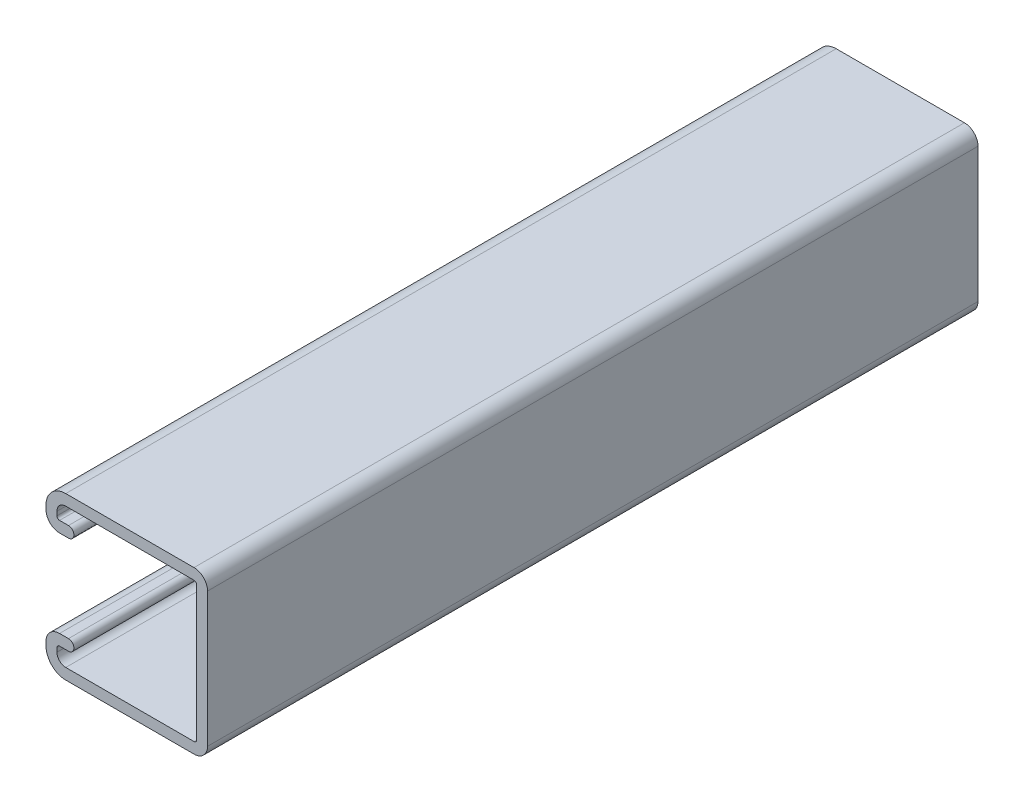
ISO-10303-21;
HEADER;
FILE_DESCRIPTION(('STEP AP214'),'2;1');
FILE_NAME('part.step','',(''),(''),'','','');
FILE_SCHEMA(('AUTOMOTIVE_DESIGN { 1 0 10303 214 1 1 1 1 }'));
ENDSEC;
DATA;
#1=APPLICATION_CONTEXT('core data for automotive mechanical design processes');
#2=APPLICATION_PROTOCOL_DEFINITION('international standard','automotive_design',2000,#1);
#3=PRODUCT_CONTEXT('',#1,'mechanical');
#4=PRODUCT('Part','Part','',(#3));
#5=PRODUCT_RELATED_PRODUCT_CATEGORY('part','',(#4));
#6=PRODUCT_DEFINITION_FORMATION('','',#4);
#7=PRODUCT_DEFINITION_CONTEXT('part definition',#1,'design');
#8=PRODUCT_DEFINITION('design','',#6,#7);
#9=PRODUCT_DEFINITION_SHAPE('','',#8);
#10=(LENGTH_UNIT() NAMED_UNIT(*) SI_UNIT(.MILLI.,.METRE.));
#11=(NAMED_UNIT(*) PLANE_ANGLE_UNIT() SI_UNIT($,.RADIAN.));
#12=(NAMED_UNIT(*) SI_UNIT($,.STERADIAN.) SOLID_ANGLE_UNIT());
#13=UNCERTAINTY_MEASURE_WITH_UNIT(LENGTH_MEASURE(1.E-05),#10,'distance_accuracy_value','');
#14=(GEOMETRIC_REPRESENTATION_CONTEXT(3) GLOBAL_UNCERTAINTY_ASSIGNED_CONTEXT((#13)) GLOBAL_UNIT_ASSIGNED_CONTEXT((#10,
#11,#12)) REPRESENTATION_CONTEXT('',''));
#15=CARTESIAN_POINT('',(0.,0.,0.));
#16=DIRECTION('',(0.,0.,1.));
#17=DIRECTION('',(1.,0.,0.));
#18=AXIS2_PLACEMENT_3D('',#15,#16,#17);
#19=CARTESIAN_POINT('',(-36.22675,15.58925,-98.425));
#20=DIRECTION('',(0.,0.,1.));
#21=DIRECTION('',(1.,0.,0.));
#22=AXIS2_PLACEMENT_3D('',#19,#20,#21);
#23=CYLINDRICAL_SURFACE('',#22,5.04825);
#24=CARTESIAN_POINT('',(-36.22675,15.58925,98.425));
#25=DIRECTION('',(0.,0.,1.));
#26=DIRECTION('',(1.,0.,0.));
#27=AXIS2_PLACEMENT_3D('',#24,#25,#26);
#28=CIRCLE('',#27,5.04825);
#29=CARTESIAN_POINT('',(-36.22675,20.6375,98.425));
#30=VERTEX_POINT('',#29);
#31=CARTESIAN_POINT('',(-41.275,15.58925,98.425));
#32=VERTEX_POINT('',#31);
#33=EDGE_CURVE('E252',#30,#32,#28,.T.);
#34=ORIENTED_EDGE('',*,*,#33,.F.);
#35=DIRECTION('',(0.,0.,1.));
#36=VECTOR('',#35,1.);
#37=CARTESIAN_POINT('',(-36.22675,20.6375,-98.425));
#38=LINE('',#37,#36);
#39=CARTESIAN_POINT('',(-36.22675,20.6375,-98.425));
#40=VERTEX_POINT('',#39);
#41=EDGE_CURVE('E11',#40,#30,#38,.T.);
#42=ORIENTED_EDGE('',*,*,#41,.F.);
#43=CARTESIAN_POINT('',(-36.22675,15.58925,-98.425));
#44=DIRECTION('',(0.,0.,1.));
#45=DIRECTION('',(1.,0.,0.));
#46=AXIS2_PLACEMENT_3D('',#43,#44,#45);
#47=CIRCLE('',#46,5.04825);
#48=CARTESIAN_POINT('',(-41.275,15.58925,-98.425));
#49=VERTEX_POINT('',#48);
#50=EDGE_CURVE('E332',#40,#49,#47,.T.);
#51=ORIENTED_EDGE('',*,*,#50,.T.);
#52=DIRECTION('',(0.,0.,1.));
#53=VECTOR('',#52,1.);
#54=CARTESIAN_POINT('',(-41.275,15.58925,-98.425));
#55=LINE('',#54,#53);
#56=EDGE_CURVE('E38',#49,#32,#55,.T.);
#57=ORIENTED_EDGE('',*,*,#56,.T.);
#58=EDGE_LOOP('',(#34,#42,#51,#57));
#59=FACE_BOUND('',#58,.T.);
#60=ADVANCED_FACE('F35',(#59),#23,.T.);
#61=CARTESIAN_POINT('',(-36.22675,20.6375,-98.425));
#62=DIRECTION('',(0.,1.,0.));
#63=DIRECTION('',(-1.,0.,0.));
#64=AXIS2_PLACEMENT_3D('',#61,#62,#63);
#65=PLANE('',#64);
#66=DIRECTION('',(-1.,0.,0.));
#67=VECTOR('',#66,1.);
#68=CARTESIAN_POINT('',(-36.22675,20.6375,98.425));
#69=LINE('',#68,#67);
#70=CARTESIAN_POINT('',(-3.46075,20.6375,98.425));
#71=VERTEX_POINT('',#70);
#72=EDGE_CURVE('E330',#71,#30,#69,.T.);
#73=ORIENTED_EDGE('',*,*,#72,.F.);
#74=DIRECTION('',(0.,0.,1.));
#75=VECTOR('',#74,1.);
#76=CARTESIAN_POINT('',(-3.46075,20.6375,-98.425));
#77=LINE('',#76,#75);
#78=CARTESIAN_POINT('',(-3.46075,20.6375,-98.425));
#79=VERTEX_POINT('',#78);
#80=EDGE_CURVE('E44',#79,#71,#77,.T.);
#81=ORIENTED_EDGE('',*,*,#80,.F.);
#82=DIRECTION('',(-1.,0.,0.));
#83=VECTOR('',#82,1.);
#84=CARTESIAN_POINT('',(-36.22675,20.6375,-98.425));
#85=LINE('',#84,#83);
#86=EDGE_CURVE('E242',#79,#40,#85,.T.);
#87=ORIENTED_EDGE('',*,*,#86,.T.);
#88=ORIENTED_EDGE('',*,*,#41,.T.);
#89=EDGE_LOOP('',(#73,#81,#87,#88));
#90=FACE_BOUND('',#89,.T.);
#91=ADVANCED_FACE('F384',(#90),#65,.T.);
#92=CARTESIAN_POINT('',(-3.46075,17.17675,-98.425));
#93=DIRECTION('',(0.,0.,1.));
#94=DIRECTION('',(1.,0.,0.));
#95=AXIS2_PLACEMENT_3D('',#92,#93,#94);
#96=CYLINDRICAL_SURFACE('',#95,3.46075);
#97=CARTESIAN_POINT('',(-3.46075,17.17675,98.425));
#98=DIRECTION('',(0.,0.,1.));
#99=DIRECTION('',(1.,0.,0.));
#100=AXIS2_PLACEMENT_3D('',#97,#98,#99);
#101=CIRCLE('',#100,3.46075);
#102=CARTESIAN_POINT('',(0.,17.17675,98.425));
#103=VERTEX_POINT('',#102);
#104=EDGE_CURVE('E229',#103,#71,#101,.T.);
#105=ORIENTED_EDGE('',*,*,#104,.F.);
#106=DIRECTION('',(0.,0.,1.));
#107=VECTOR('',#106,1.);
#108=CARTESIAN_POINT('',(0.,17.17675,-98.425));
#109=LINE('',#108,#107);
#110=CARTESIAN_POINT('',(0.,17.17675,-98.425));
#111=VERTEX_POINT('',#110);
#112=EDGE_CURVE('E224',#111,#103,#109,.T.);
#113=ORIENTED_EDGE('',*,*,#112,.F.);
#114=CARTESIAN_POINT('',(-3.46075,17.17675,-98.425));
#115=DIRECTION('',(0.,0.,1.));
#116=DIRECTION('',(1.,0.,0.));
#117=AXIS2_PLACEMENT_3D('',#114,#115,#116);
#118=CIRCLE('',#117,3.46075);
#119=EDGE_CURVE('E227',#111,#79,#118,.T.);
#120=ORIENTED_EDGE('',*,*,#119,.T.);
#121=ORIENTED_EDGE('',*,*,#80,.T.);
#122=EDGE_LOOP('',(#105,#113,#120,#121));
#123=FACE_BOUND('',#122,.T.);
#124=ADVANCED_FACE('F226',(#123),#96,.T.);
#125=CARTESIAN_POINT('',(0.,17.17675,-98.425));
#126=DIRECTION('',(1.,0.,0.));
#127=DIRECTION('',(0.,1.,0.));
#128=AXIS2_PLACEMENT_3D('',#125,#126,#127);
#129=PLANE('',#128);
#130=DIRECTION('',(0.,1.,0.));
#131=VECTOR('',#130,1.);
#132=CARTESIAN_POINT('',(0.,17.17675,98.425));
#133=LINE('',#132,#131);
#134=CARTESIAN_POINT('',(0.,-17.17675,98.425));
#135=VERTEX_POINT('',#134);
#136=EDGE_CURVE('E327',#135,#103,#133,.T.);
#137=ORIENTED_EDGE('',*,*,#136,.F.);
#138=DIRECTION('',(0.,0.,1.));
#139=VECTOR('',#138,1.);
#140=CARTESIAN_POINT('',(0.,-17.17675,-98.425));
#141=LINE('',#140,#139);
#142=CARTESIAN_POINT('',(0.,-17.17675,-98.425));
#143=VERTEX_POINT('',#142);
#144=EDGE_CURVE('E234',#143,#135,#141,.T.);
#145=ORIENTED_EDGE('',*,*,#144,.F.);
#146=DIRECTION('',(0.,1.,0.));
#147=VECTOR('',#146,1.);
#148=CARTESIAN_POINT('',(0.,17.17675,-98.425));
#149=LINE('',#148,#147);
#150=EDGE_CURVE('E240',#143,#111,#149,.T.);
#151=ORIENTED_EDGE('',*,*,#150,.T.);
#152=ORIENTED_EDGE('',*,*,#112,.T.);
#153=EDGE_LOOP('',(#137,#145,#151,#152));
#154=FACE_BOUND('',#153,.T.);
#155=ADVANCED_FACE('F244',(#154),#129,.T.);
#156=CARTESIAN_POINT('',(-3.46075,-17.17675,-98.425));
#157=DIRECTION('',(0.,0.,1.));
#158=DIRECTION('',(1.,0.,0.));
#159=AXIS2_PLACEMENT_3D('',#156,#157,#158);
#160=CYLINDRICAL_SURFACE('',#159,3.46075);
#161=CARTESIAN_POINT('',(-3.46075,-17.17675,98.425));
#162=DIRECTION('',(0.,0.,1.));
#163=DIRECTION('',(-1.,0.,0.));
#164=AXIS2_PLACEMENT_3D('',#161,#162,#163);
#165=CIRCLE('',#164,3.46075);
#166=CARTESIAN_POINT('',(-3.46075,-20.6375,98.425));
#167=VERTEX_POINT('',#166);
#168=EDGE_CURVE('E324',#167,#135,#165,.T.);
#169=ORIENTED_EDGE('',*,*,#168,.F.);
#170=DIRECTION('',(0.,0.,1.));
#171=VECTOR('',#170,1.);
#172=CARTESIAN_POINT('',(-3.46075,-20.6375,-98.425));
#173=LINE('',#172,#171);
#174=CARTESIAN_POINT('',(-3.46075,-20.6375,-98.425));
#175=VERTEX_POINT('',#174);
#176=EDGE_CURVE('E336',#175,#167,#173,.T.);
#177=ORIENTED_EDGE('',*,*,#176,.F.);
#178=CARTESIAN_POINT('',(-3.46075,-17.17675,-98.425));
#179=DIRECTION('',(0.,0.,1.));
#180=DIRECTION('',(-1.,0.,0.));
#181=AXIS2_PLACEMENT_3D('',#178,#179,#180);
#182=CIRCLE('',#181,3.46075);
#183=EDGE_CURVE('E245',#175,#143,#182,.T.);
#184=ORIENTED_EDGE('',*,*,#183,.T.);
#185=ORIENTED_EDGE('',*,*,#144,.T.);
#186=EDGE_LOOP('',(#169,#177,#184,#185));
#187=FACE_BOUND('',#186,.T.);
#188=ADVANCED_FACE('F397',(#187),#160,.T.);
#189=CARTESIAN_POINT('',(-36.22675,-20.6375,-98.425));
#190=DIRECTION('',(0.,-1.,0.));
#191=DIRECTION('',(1.,0.,0.));
#192=AXIS2_PLACEMENT_3D('',#189,#190,#191);
#193=PLANE('',#192);
#194=DIRECTION('',(1.,0.,0.));
#195=VECTOR('',#194,1.);
#196=CARTESIAN_POINT('',(-36.22675,-20.6375,98.425));
#197=LINE('',#196,#195);
#198=CARTESIAN_POINT('',(-36.22675,-20.6375,98.425));
#199=VERTEX_POINT('',#198);
#200=EDGE_CURVE('E321',#199,#167,#197,.T.);
#201=ORIENTED_EDGE('',*,*,#200,.F.);
#202=DIRECTION('',(0.,0.,1.));
#203=VECTOR('',#202,1.);
#204=CARTESIAN_POINT('',(-36.22675,-20.6375,-98.425));
#205=LINE('',#204,#203);
#206=CARTESIAN_POINT('',(-36.22675,-20.6375,-98.425));
#207=VERTEX_POINT('',#206);
#208=EDGE_CURVE('E338',#207,#199,#205,.T.);
#209=ORIENTED_EDGE('',*,*,#208,.F.);
#210=DIRECTION('',(1.,0.,0.));
#211=VECTOR('',#210,1.);
#212=CARTESIAN_POINT('',(-36.22675,-20.6375,-98.425));
#213=LINE('',#212,#211);
#214=EDGE_CURVE('E247',#207,#175,#213,.T.);
#215=ORIENTED_EDGE('',*,*,#214,.T.);
#216=ORIENTED_EDGE('',*,*,#176,.T.);
#217=EDGE_LOOP('',(#201,#209,#215,#216));
#218=FACE_BOUND('',#217,.T.);
#219=ADVANCED_FACE('F400',(#218),#193,.T.);
#220=CARTESIAN_POINT('',(-36.22675,-15.58925,-98.425));
#221=DIRECTION('',(0.,0.,1.));
#222=DIRECTION('',(1.,0.,0.));
#223=AXIS2_PLACEMENT_3D('',#220,#221,#222);
#224=CYLINDRICAL_SURFACE('',#223,5.04825);
#225=CARTESIAN_POINT('',(-36.22675,-15.58925,98.425));
#226=DIRECTION('',(0.,0.,1.));
#227=DIRECTION('',(-1.,0.,0.));
#228=AXIS2_PLACEMENT_3D('',#225,#226,#227);
#229=CIRCLE('',#228,5.04825);
#230=CARTESIAN_POINT('',(-41.275,-15.58925,98.425));
#231=VERTEX_POINT('',#230);
#232=EDGE_CURVE('E318',#231,#199,#229,.T.);
#233=ORIENTED_EDGE('',*,*,#232,.F.);
#234=DIRECTION('',(0.,0.,1.));
#235=VECTOR('',#234,1.);
#236=CARTESIAN_POINT('',(-41.275,-15.58925,-98.425));
#237=LINE('',#236,#235);
#238=CARTESIAN_POINT('',(-41.275,-15.58925,-98.425));
#239=VERTEX_POINT('',#238);
#240=EDGE_CURVE('E340',#239,#231,#237,.T.);
#241=ORIENTED_EDGE('',*,*,#240,.F.);
#242=CARTESIAN_POINT('',(-36.22675,-15.58925,-98.425));
#243=DIRECTION('',(0.,0.,1.));
#244=DIRECTION('',(-1.,0.,0.));
#245=AXIS2_PLACEMENT_3D('',#242,#243,#244);
#246=CIRCLE('',#245,5.04825);
#247=EDGE_CURVE('E745',#239,#207,#246,.T.);
#248=ORIENTED_EDGE('',*,*,#247,.T.);
#249=ORIENTED_EDGE('',*,*,#208,.T.);
#250=EDGE_LOOP('',(#233,#241,#248,#249));
#251=FACE_BOUND('',#250,.T.);
#252=ADVANCED_FACE('F404',(#251),#224,.T.);
#253=CARTESIAN_POINT('',(-41.275,-15.58925,-98.425));
#254=DIRECTION('',(-1.,0.,0.));
#255=DIRECTION('',(0.,0.,1.));
#256=AXIS2_PLACEMENT_3D('',#253,#254,#255);
#257=PLANE('',#256);
#258=DIRECTION('',(0.,-1.,0.));
#259=VECTOR('',#258,1.);
#260=CARTESIAN_POINT('',(-41.275,-15.58925,98.425));
#261=LINE('',#260,#259);
#262=CARTESIAN_POINT('',(-41.275,-14.57325,98.425));
#263=VERTEX_POINT('',#262);
#264=EDGE_CURVE('E315',#263,#231,#261,.T.);
#265=ORIENTED_EDGE('',*,*,#264,.F.);
#266=DIRECTION('',(0.,0.,1.));
#267=VECTOR('',#266,1.);
#268=CARTESIAN_POINT('',(-41.275,-14.57325,-98.425));
#269=LINE('',#268,#267);
#270=CARTESIAN_POINT('',(-41.275,-14.57325,-98.425));
#271=VERTEX_POINT('',#270);
#272=EDGE_CURVE('E342',#271,#263,#269,.T.);
#273=ORIENTED_EDGE('',*,*,#272,.F.);
#274=DIRECTION('',(0.,-1.,0.));
#275=VECTOR('',#274,1.);
#276=CARTESIAN_POINT('',(-41.275,-15.58925,-98.425));
#277=LINE('',#276,#275);
#278=EDGE_CURVE('E741',#271,#239,#277,.T.);
#279=ORIENTED_EDGE('',*,*,#278,.T.);
#280=ORIENTED_EDGE('',*,*,#240,.T.);
#281=EDGE_LOOP('',(#265,#273,#279,#280));
#282=FACE_BOUND('',#281,.T.);
#283=ADVANCED_FACE('F408',(#282),#257,.T.);
#284=CARTESIAN_POINT('',(-37.81425,-14.57325,-98.425));
#285=DIRECTION('',(0.,0.,1.));
#286=DIRECTION('',(1.,0.,0.));
#287=AXIS2_PLACEMENT_3D('',#284,#285,#286);
#288=CYLINDRICAL_SURFACE('',#287,3.46075);
#289=CARTESIAN_POINT('',(-37.81425,-14.57325,98.425));
#290=DIRECTION('',(0.,0.,1.));
#291=DIRECTION('',(-1.,0.,0.));
#292=AXIS2_PLACEMENT_3D('',#289,#290,#291);
#293=CIRCLE('',#292,3.46075);
#294=CARTESIAN_POINT('',(-37.81425,-11.1125,98.425));
#295=VERTEX_POINT('',#294);
#296=EDGE_CURVE('E312',#295,#263,#293,.T.);
#297=ORIENTED_EDGE('',*,*,#296,.F.);
#298=DIRECTION('',(0.,0.,1.));
#299=VECTOR('',#298,1.);
#300=CARTESIAN_POINT('',(-37.81425,-11.1125,-98.425));
#301=LINE('',#300,#299);
#302=CARTESIAN_POINT('',(-37.81425,-11.1125,-98.425));
#303=VERTEX_POINT('',#302);
#304=EDGE_CURVE('E344',#303,#295,#301,.T.);
#305=ORIENTED_EDGE('',*,*,#304,.F.);
#306=CARTESIAN_POINT('',(-37.81425,-14.57325,-98.425));
#307=DIRECTION('',(0.,0.,1.));
#308=DIRECTION('',(-1.,0.,0.));
#309=AXIS2_PLACEMENT_3D('',#306,#307,#308);
#310=CIRCLE('',#309,3.46075);
#311=EDGE_CURVE('E752',#303,#271,#310,.T.);
#312=ORIENTED_EDGE('',*,*,#311,.T.);
#313=ORIENTED_EDGE('',*,*,#272,.T.);
#314=EDGE_LOOP('',(#297,#305,#312,#313));
#315=FACE_BOUND('',#314,.T.);
#316=ADVANCED_FACE('F412',(#315),#288,.T.);
#317=CARTESIAN_POINT('',(-37.81425,-11.1125,-98.425));
#318=DIRECTION('',(0.,1.,0.));
#319=DIRECTION('',(-1.,0.,0.));
#320=AXIS2_PLACEMENT_3D('',#317,#318,#319);
#321=PLANE('',#320);
#322=DIRECTION('',(-1.,0.,0.));
#323=VECTOR('',#322,1.);
#324=CARTESIAN_POINT('',(-37.81425,-11.1125,98.425));
#325=LINE('',#324,#323);
#326=CARTESIAN_POINT('',(-35.5346,-11.1125,98.425));
#327=VERTEX_POINT('',#326);
#328=EDGE_CURVE('E309',#327,#295,#325,.T.);
#329=ORIENTED_EDGE('',*,*,#328,.F.);
#330=DIRECTION('',(0.,0.,1.));
#331=VECTOR('',#330,1.);
#332=CARTESIAN_POINT('',(-35.5346,-11.1125,-98.425));
#333=LINE('',#332,#331);
#334=CARTESIAN_POINT('',(-35.5346,-11.1125,-98.425));
#335=VERTEX_POINT('',#334);
#336=EDGE_CURVE('E346',#335,#327,#333,.T.);
#337=ORIENTED_EDGE('',*,*,#336,.F.);
#338=DIRECTION('',(-1.,0.,0.));
#339=VECTOR('',#338,1.);
#340=CARTESIAN_POINT('',(-37.81425,-11.1125,-98.425));
#341=LINE('',#340,#339);
#342=EDGE_CURVE('E734',#335,#303,#341,.T.);
#343=ORIENTED_EDGE('',*,*,#342,.T.);
#344=ORIENTED_EDGE('',*,*,#304,.T.);
#345=EDGE_LOOP('',(#329,#337,#343,#344));
#346=FACE_BOUND('',#345,.T.);
#347=ADVANCED_FACE('F416',(#346),#321,.T.);
#348=CARTESIAN_POINT('',(-35.5346,-12.5095,-98.425));
#349=DIRECTION('',(0.,0.,1.));
#350=DIRECTION('',(1.,0.,0.));
#351=AXIS2_PLACEMENT_3D('',#348,#349,#350);
#352=CYLINDRICAL_SURFACE('',#351,1.397);
#353=CARTESIAN_POINT('',(-35.5346,-12.5095,98.425));
#354=DIRECTION('',(0.,0.,1.));
#355=DIRECTION('',(-1.,0.,0.));
#356=AXIS2_PLACEMENT_3D('',#353,#354,#355);
#357=CIRCLE('',#356,1.397);
#358=CARTESIAN_POINT('',(-35.5346,-13.9065,98.425));
#359=VERTEX_POINT('',#358);
#360=EDGE_CURVE('E306',#359,#327,#357,.T.);
#361=ORIENTED_EDGE('',*,*,#360,.F.);
#362=DIRECTION('',(0.,0.,1.));
#363=VECTOR('',#362,1.);
#364=CARTESIAN_POINT('',(-35.5346,-13.9065,-98.425));
#365=LINE('',#364,#363);
#366=CARTESIAN_POINT('',(-35.5346,-13.9065,-98.425));
#367=VERTEX_POINT('',#366);
#368=EDGE_CURVE('E348',#367,#359,#365,.T.);
#369=ORIENTED_EDGE('',*,*,#368,.F.);
#370=CARTESIAN_POINT('',(-35.5346,-12.5095,-98.425));
#371=DIRECTION('',(0.,0.,1.));
#372=DIRECTION('',(-1.,0.,0.));
#373=AXIS2_PLACEMENT_3D('',#370,#371,#372);
#374=CIRCLE('',#373,1.397);
#375=EDGE_CURVE('E730',#367,#335,#374,.T.);
#376=ORIENTED_EDGE('',*,*,#375,.T.);
#377=ORIENTED_EDGE('',*,*,#336,.T.);
#378=EDGE_LOOP('',(#361,#369,#376,#377));
#379=FACE_BOUND('',#378,.T.);
#380=ADVANCED_FACE('F420',(#379),#352,.T.);
#381=CARTESIAN_POINT('',(-35.5346,-13.9065,-98.425));
#382=DIRECTION('',(0.,-1.,0.));
#383=DIRECTION('',(0.,0.,-1.));
#384=AXIS2_PLACEMENT_3D('',#381,#382,#383);
#385=PLANE('',#384);
#386=DIRECTION('',(1.,0.,0.));
#387=VECTOR('',#386,1.);
#388=CARTESIAN_POINT('',(-35.5346,-13.9065,98.425));
#389=LINE('',#388,#387);
#390=CARTESIAN_POINT('',(-37.81425,-13.9065,98.425));
#391=VERTEX_POINT('',#390);
#392=EDGE_CURVE('E303',#391,#359,#389,.T.);
#393=ORIENTED_EDGE('',*,*,#392,.F.);
#394=DIRECTION('',(0.,0.,1.));
#395=VECTOR('',#394,1.);
#396=CARTESIAN_POINT('',(-37.81425,-13.9065,-98.425));
#397=LINE('',#396,#395);
#398=CARTESIAN_POINT('',(-37.81425,-13.9065,-98.425));
#399=VERTEX_POINT('',#398);
#400=EDGE_CURVE('E350',#399,#391,#397,.T.);
#401=ORIENTED_EDGE('',*,*,#400,.F.);
#402=DIRECTION('',(1.,0.,0.));
#403=VECTOR('',#402,1.);
#404=CARTESIAN_POINT('',(-35.5346,-13.9065,-98.425));
#405=LINE('',#404,#403);
#406=EDGE_CURVE('E756',#399,#367,#405,.T.);
#407=ORIENTED_EDGE('',*,*,#406,.T.);
#408=ORIENTED_EDGE('',*,*,#368,.T.);
#409=EDGE_LOOP('',(#393,#401,#407,#408));
#410=FACE_BOUND('',#409,.T.);
#411=ADVANCED_FACE('F424',(#410),#385,.T.);
#412=CARTESIAN_POINT('',(-37.81425,-14.57325,-98.425));
#413=DIRECTION('',(0.,0.,1.));
#414=DIRECTION('',(1.,0.,0.));
#415=AXIS2_PLACEMENT_3D('',#412,#413,#414);
#416=CYLINDRICAL_SURFACE('',#415,0.666750000000008);
#417=CARTESIAN_POINT('',(-37.81425,-14.57325,98.425));
#418=DIRECTION('',(0.,0.,-1.));
#419=DIRECTION('',(1.,0.,0.));
#420=AXIS2_PLACEMENT_3D('',#417,#418,#419);
#421=CIRCLE('',#420,0.666750000000008);
#422=CARTESIAN_POINT('',(-38.481,-14.57325,98.425));
#423=VERTEX_POINT('',#422);
#424=EDGE_CURVE('E300',#423,#391,#421,.T.);
#425=ORIENTED_EDGE('',*,*,#424,.F.);
#426=DIRECTION('',(0.,0.,1.));
#427=VECTOR('',#426,1.);
#428=CARTESIAN_POINT('',(-38.481,-14.57325,-98.425));
#429=LINE('',#428,#427);
#430=CARTESIAN_POINT('',(-38.481,-14.57325,-98.425));
#431=VERTEX_POINT('',#430);
#432=EDGE_CURVE('E352',#431,#423,#429,.T.);
#433=ORIENTED_EDGE('',*,*,#432,.F.);
#434=CARTESIAN_POINT('',(-37.81425,-14.57325,-98.425));
#435=DIRECTION('',(0.,0.,-1.));
#436=DIRECTION('',(1.,0.,0.));
#437=AXIS2_PLACEMENT_3D('',#434,#435,#436);
#438=CIRCLE('',#437,0.666750000000008);
#439=EDGE_CURVE('E723',#431,#399,#438,.T.);
#440=ORIENTED_EDGE('',*,*,#439,.T.);
#441=ORIENTED_EDGE('',*,*,#400,.T.);
#442=EDGE_LOOP('',(#425,#433,#440,#441));
#443=FACE_BOUND('',#442,.T.);
#444=ADVANCED_FACE('F428',(#443),#416,.F.);
#445=CARTESIAN_POINT('',(-38.481,-14.57325,-98.425));
#446=DIRECTION('',(1.,0.,0.));
#447=DIRECTION('',(0.,0.,-1.));
#448=AXIS2_PLACEMENT_3D('',#445,#446,#447);
#449=PLANE('',#448);
#450=DIRECTION('',(0.,1.,0.));
#451=VECTOR('',#450,1.);
#452=CARTESIAN_POINT('',(-38.481,-14.57325,98.425));
#453=LINE('',#452,#451);
#454=CARTESIAN_POINT('',(-38.481,-15.58925,98.425));
#455=VERTEX_POINT('',#454);
#456=EDGE_CURVE('E297',#455,#423,#453,.T.);
#457=ORIENTED_EDGE('',*,*,#456,.F.);
#458=DIRECTION('',(0.,0.,1.));
#459=VECTOR('',#458,1.);
#460=CARTESIAN_POINT('',(-38.481,-15.58925,-98.425));
#461=LINE('',#460,#459);
#462=CARTESIAN_POINT('',(-38.481,-15.58925,-98.425));
#463=VERTEX_POINT('',#462);
#464=EDGE_CURVE('E354',#463,#455,#461,.T.);
#465=ORIENTED_EDGE('',*,*,#464,.F.);
#466=DIRECTION('',(0.,1.,0.));
#467=VECTOR('',#466,1.);
#468=CARTESIAN_POINT('',(-38.481,-14.57325,-98.425));
#469=LINE('',#468,#467);
#470=EDGE_CURVE('E719',#463,#431,#469,.T.);
#471=ORIENTED_EDGE('',*,*,#470,.T.);
#472=ORIENTED_EDGE('',*,*,#432,.T.);
#473=EDGE_LOOP('',(#457,#465,#471,#472));
#474=FACE_BOUND('',#473,.T.);
#475=ADVANCED_FACE('F432',(#474),#449,.T.);
#476=CARTESIAN_POINT('',(-36.22675,-15.58925,-98.425));
#477=DIRECTION('',(0.,0.,1.));
#478=DIRECTION('',(1.,0.,0.));
#479=AXIS2_PLACEMENT_3D('',#476,#477,#478);
#480=CYLINDRICAL_SURFACE('',#479,2.25425);
#481=CARTESIAN_POINT('',(-36.22675,-15.58925,98.425));
#482=DIRECTION('',(0.,0.,-1.));
#483=DIRECTION('',(1.,0.,0.));
#484=AXIS2_PLACEMENT_3D('',#481,#482,#483);
#485=CIRCLE('',#484,2.25425);
#486=CARTESIAN_POINT('',(-36.22675,-17.8435,98.425));
#487=VERTEX_POINT('',#486);
#488=EDGE_CURVE('E294',#487,#455,#485,.T.);
#489=ORIENTED_EDGE('',*,*,#488,.F.);
#490=DIRECTION('',(0.,0.,1.));
#491=VECTOR('',#490,1.);
#492=CARTESIAN_POINT('',(-36.22675,-17.8435,-98.425));
#493=LINE('',#492,#491);
#494=CARTESIAN_POINT('',(-36.22675,-17.8435,-98.425));
#495=VERTEX_POINT('',#494);
#496=EDGE_CURVE('E356',#495,#487,#493,.T.);
#497=ORIENTED_EDGE('',*,*,#496,.F.);
#498=CARTESIAN_POINT('',(-36.22675,-15.58925,-98.425));
#499=DIRECTION('',(0.,0.,-1.));
#500=DIRECTION('',(1.,0.,0.));
#501=AXIS2_PLACEMENT_3D('',#498,#499,#500);
#502=CIRCLE('',#501,2.25425);
#503=EDGE_CURVE('E760',#495,#463,#502,.T.);
#504=ORIENTED_EDGE('',*,*,#503,.T.);
#505=ORIENTED_EDGE('',*,*,#464,.T.);
#506=EDGE_LOOP('',(#489,#497,#504,#505));
#507=FACE_BOUND('',#506,.T.);
#508=ADVANCED_FACE('F436',(#507),#480,.F.);
#509=CARTESIAN_POINT('',(-3.46075,-17.8435,-98.425));
#510=DIRECTION('',(0.,1.,0.));
#511=DIRECTION('',(-1.,0.,0.));
#512=AXIS2_PLACEMENT_3D('',#509,#510,#511);
#513=PLANE('',#512);
#514=DIRECTION('',(-1.,0.,0.));
#515=VECTOR('',#514,1.);
#516=CARTESIAN_POINT('',(-3.46075,-17.8435,98.425));
#517=LINE('',#516,#515);
#518=CARTESIAN_POINT('',(-3.46075,-17.8435,98.425));
#519=VERTEX_POINT('',#518);
#520=EDGE_CURVE('E291',#519,#487,#517,.T.);
#521=ORIENTED_EDGE('',*,*,#520,.F.);
#522=DIRECTION('',(0.,0.,1.));
#523=VECTOR('',#522,1.);
#524=CARTESIAN_POINT('',(-3.46075,-17.8435,-98.425));
#525=LINE('',#524,#523);
#526=CARTESIAN_POINT('',(-3.46075,-17.8435,-98.425));
#527=VERTEX_POINT('',#526);
#528=EDGE_CURVE('E358',#527,#519,#525,.T.);
#529=ORIENTED_EDGE('',*,*,#528,.F.);
#530=DIRECTION('',(-1.,0.,0.));
#531=VECTOR('',#530,1.);
#532=CARTESIAN_POINT('',(-3.46075,-17.8435,-98.425));
#533=LINE('',#532,#531);
#534=EDGE_CURVE('E712',#527,#495,#533,.T.);
#535=ORIENTED_EDGE('',*,*,#534,.T.);
#536=ORIENTED_EDGE('',*,*,#496,.T.);
#537=EDGE_LOOP('',(#521,#529,#535,#536));
#538=FACE_BOUND('',#537,.T.);
#539=ADVANCED_FACE('F440',(#538),#513,.T.);
#540=CARTESIAN_POINT('',(-3.46075,-17.17675,-98.425));
#541=DIRECTION('',(0.,0.,1.));
#542=DIRECTION('',(1.,0.,0.));
#543=AXIS2_PLACEMENT_3D('',#540,#541,#542);
#544=CYLINDRICAL_SURFACE('',#543,0.666750000000002);
#545=CARTESIAN_POINT('',(-3.46075,-17.17675,98.425));
#546=DIRECTION('',(0.,0.,-1.));
#547=DIRECTION('',(-1.,0.,0.));
#548=AXIS2_PLACEMENT_3D('',#545,#546,#547);
#549=CIRCLE('',#548,0.666750000000002);
#550=CARTESIAN_POINT('',(-2.79399999999999,-17.17675,98.425));
#551=VERTEX_POINT('',#550);
#552=EDGE_CURVE('E288',#551,#519,#549,.T.);
#553=ORIENTED_EDGE('',*,*,#552,.F.);
#554=DIRECTION('',(0.,0.,1.));
#555=VECTOR('',#554,1.);
#556=CARTESIAN_POINT('',(-2.79399999999999,-17.17675,-98.425));
#557=LINE('',#556,#555);
#558=CARTESIAN_POINT('',(-2.79399999999999,-17.17675,-98.425));
#559=VERTEX_POINT('',#558);
#560=EDGE_CURVE('E360',#559,#551,#557,.T.);
#561=ORIENTED_EDGE('',*,*,#560,.F.);
#562=CARTESIAN_POINT('',(-3.46075,-17.17675,-98.425));
#563=DIRECTION('',(0.,0.,-1.));
#564=DIRECTION('',(-1.,0.,0.));
#565=AXIS2_PLACEMENT_3D('',#562,#563,#564);
#566=CIRCLE('',#565,0.666750000000002);
#567=EDGE_CURVE('E708',#559,#527,#566,.T.);
#568=ORIENTED_EDGE('',*,*,#567,.T.);
#569=ORIENTED_EDGE('',*,*,#528,.T.);
#570=EDGE_LOOP('',(#553,#561,#568,#569));
#571=FACE_BOUND('',#570,.T.);
#572=ADVANCED_FACE('F444',(#571),#544,.F.);
#573=CARTESIAN_POINT('',(-2.794,-17.17675,-98.425));
#574=DIRECTION('',(-1.,0.,0.));
#575=DIRECTION('',(0.,-1.,0.));
#576=AXIS2_PLACEMENT_3D('',#573,#574,#575);
#577=PLANE('',#576);
#578=DIRECTION('',(0.,-1.,0.));
#579=VECTOR('',#578,1.);
#580=CARTESIAN_POINT('',(-2.794,-17.17675,98.425));
#581=LINE('',#580,#579);
#582=CARTESIAN_POINT('',(-2.794,17.17675,98.425));
#583=VERTEX_POINT('',#582);
#584=EDGE_CURVE('E285',#583,#551,#581,.T.);
#585=ORIENTED_EDGE('',*,*,#584,.F.);
#586=DIRECTION('',(0.,0.,1.));
#587=VECTOR('',#586,1.);
#588=CARTESIAN_POINT('',(-2.794,17.17675,-98.425));
#589=LINE('',#588,#587);
#590=CARTESIAN_POINT('',(-2.794,17.17675,-98.425));
#591=VERTEX_POINT('',#590);
#592=EDGE_CURVE('E362',#591,#583,#589,.T.);
#593=ORIENTED_EDGE('',*,*,#592,.F.);
#594=DIRECTION('',(0.,-1.,0.));
#595=VECTOR('',#594,1.);
#596=CARTESIAN_POINT('',(-2.794,-17.17675,-98.425));
#597=LINE('',#596,#595);
#598=EDGE_CURVE('E764',#591,#559,#597,.T.);
#599=ORIENTED_EDGE('',*,*,#598,.T.);
#600=ORIENTED_EDGE('',*,*,#560,.T.);
#601=EDGE_LOOP('',(#585,#593,#599,#600));
#602=FACE_BOUND('',#601,.T.);
#603=ADVANCED_FACE('F448',(#602),#577,.T.);
#604=CARTESIAN_POINT('',(-3.46075,17.17675,-98.425));
#605=DIRECTION('',(0.,0.,1.));
#606=DIRECTION('',(1.,0.,0.));
#607=AXIS2_PLACEMENT_3D('',#604,#605,#606);
#608=CYLINDRICAL_SURFACE('',#607,0.666750000000002);
#609=CARTESIAN_POINT('',(-3.46075,17.17675,98.425));
#610=DIRECTION('',(0.,0.,-1.));
#611=DIRECTION('',(1.,0.,0.));
#612=AXIS2_PLACEMENT_3D('',#609,#610,#611);
#613=CIRCLE('',#612,0.666750000000002);
#614=CARTESIAN_POINT('',(-3.46075,17.8435,98.425));
#615=VERTEX_POINT('',#614);
#616=EDGE_CURVE('E282',#615,#583,#613,.T.);
#617=ORIENTED_EDGE('',*,*,#616,.F.);
#618=DIRECTION('',(0.,0.,1.));
#619=VECTOR('',#618,1.);
#620=CARTESIAN_POINT('',(-3.46075,17.8435,-98.425));
#621=LINE('',#620,#619);
#622=CARTESIAN_POINT('',(-3.46075,17.8435,-98.425));
#623=VERTEX_POINT('',#622);
#624=EDGE_CURVE('E364',#623,#615,#621,.T.);
#625=ORIENTED_EDGE('',*,*,#624,.F.);
#626=CARTESIAN_POINT('',(-3.46075,17.17675,-98.425));
#627=DIRECTION('',(0.,0.,-1.));
#628=DIRECTION('',(1.,0.,0.));
#629=AXIS2_PLACEMENT_3D('',#626,#627,#628);
#630=CIRCLE('',#629,0.666750000000002);
#631=EDGE_CURVE('E701',#623,#591,#630,.T.);
#632=ORIENTED_EDGE('',*,*,#631,.T.);
#633=ORIENTED_EDGE('',*,*,#592,.T.);
#634=EDGE_LOOP('',(#617,#625,#632,#633));
#635=FACE_BOUND('',#634,.T.);
#636=ADVANCED_FACE('F452',(#635),#608,.F.);
#637=CARTESIAN_POINT('',(-3.46075,17.8435,-98.425));
#638=DIRECTION('',(0.,-1.,0.));
#639=DIRECTION('',(0.,0.,-1.));
#640=AXIS2_PLACEMENT_3D('',#637,#638,#639);
#641=PLANE('',#640);
#642=DIRECTION('',(1.,0.,0.));
#643=VECTOR('',#642,1.);
#644=CARTESIAN_POINT('',(-3.46075,17.8435,98.425));
#645=LINE('',#644,#643);
#646=CARTESIAN_POINT('',(-36.22675,17.8435,98.425));
#647=VERTEX_POINT('',#646);
#648=EDGE_CURVE('E279',#647,#615,#645,.T.);
#649=ORIENTED_EDGE('',*,*,#648,.F.);
#650=DIRECTION('',(0.,0.,1.));
#651=VECTOR('',#650,1.);
#652=CARTESIAN_POINT('',(-36.22675,17.8435,-98.425));
#653=LINE('',#652,#651);
#654=CARTESIAN_POINT('',(-36.22675,17.8435,-98.425));
#655=VERTEX_POINT('',#654);
#656=EDGE_CURVE('E366',#655,#647,#653,.T.);
#657=ORIENTED_EDGE('',*,*,#656,.F.);
#658=DIRECTION('',(1.,0.,0.));
#659=VECTOR('',#658,1.);
#660=CARTESIAN_POINT('',(-3.46075,17.8435,-98.425));
#661=LINE('',#660,#659);
#662=EDGE_CURVE('E697',#655,#623,#661,.T.);
#663=ORIENTED_EDGE('',*,*,#662,.T.);
#664=ORIENTED_EDGE('',*,*,#624,.T.);
#665=EDGE_LOOP('',(#649,#657,#663,#664));
#666=FACE_BOUND('',#665,.T.);
#667=ADVANCED_FACE('F456',(#666),#641,.T.);
#668=CARTESIAN_POINT('',(-36.22675,15.58925,-98.425));
#669=DIRECTION('',(0.,0.,1.));
#670=DIRECTION('',(1.,0.,0.));
#671=AXIS2_PLACEMENT_3D('',#668,#669,#670);
#672=CYLINDRICAL_SURFACE('',#671,2.25425);
#673=CARTESIAN_POINT('',(-36.22675,15.58925,98.425));
#674=DIRECTION('',(0.,0.,-1.));
#675=DIRECTION('',(-1.,0.,0.));
#676=AXIS2_PLACEMENT_3D('',#673,#674,#675);
#677=CIRCLE('',#676,2.25425);
#678=CARTESIAN_POINT('',(-38.481,15.58925,98.425));
#679=VERTEX_POINT('',#678);
#680=EDGE_CURVE('E276',#679,#647,#677,.T.);
#681=ORIENTED_EDGE('',*,*,#680,.F.);
#682=DIRECTION('',(0.,0.,1.));
#683=VECTOR('',#682,1.);
#684=CARTESIAN_POINT('',(-38.481,15.58925,-98.425));
#685=LINE('',#684,#683);
#686=CARTESIAN_POINT('',(-38.481,15.58925,-98.425));
#687=VERTEX_POINT('',#686);
#688=EDGE_CURVE('E368',#687,#679,#685,.T.);
#689=ORIENTED_EDGE('',*,*,#688,.F.);
#690=CARTESIAN_POINT('',(-36.22675,15.58925,-98.425));
#691=DIRECTION('',(0.,0.,-1.));
#692=DIRECTION('',(-1.,0.,0.));
#693=AXIS2_PLACEMENT_3D('',#690,#691,#692);
#694=CIRCLE('',#693,2.25425);
#695=EDGE_CURVE('E768',#687,#655,#694,.T.);
#696=ORIENTED_EDGE('',*,*,#695,.T.);
#697=ORIENTED_EDGE('',*,*,#656,.T.);
#698=EDGE_LOOP('',(#681,#689,#696,#697));
#699=FACE_BOUND('',#698,.T.);
#700=ADVANCED_FACE('F460',(#699),#672,.F.);
#701=CARTESIAN_POINT('',(-38.481,14.57325,-98.425));
#702=DIRECTION('',(1.,0.,0.));
#703=DIRECTION('',(0.,0.,-1.));
#704=AXIS2_PLACEMENT_3D('',#701,#702,#703);
#705=PLANE('',#704);
#706=DIRECTION('',(0.,1.,0.));
#707=VECTOR('',#706,1.);
#708=CARTESIAN_POINT('',(-38.481,14.57325,98.425));
#709=LINE('',#708,#707);
#710=CARTESIAN_POINT('',(-38.481,14.57325,98.425));
#711=VERTEX_POINT('',#710);
#712=EDGE_CURVE('E273',#711,#679,#709,.T.);
#713=ORIENTED_EDGE('',*,*,#712,.F.);
#714=DIRECTION('',(0.,0.,1.));
#715=VECTOR('',#714,1.);
#716=CARTESIAN_POINT('',(-38.481,14.57325,-98.425));
#717=LINE('',#716,#715);
#718=CARTESIAN_POINT('',(-38.481,14.57325,-98.425));
#719=VERTEX_POINT('',#718);
#720=EDGE_CURVE('E370',#719,#711,#717,.T.);
#721=ORIENTED_EDGE('',*,*,#720,.F.);
#722=DIRECTION('',(0.,1.,0.));
#723=VECTOR('',#722,1.);
#724=CARTESIAN_POINT('',(-38.481,14.57325,-98.425));
#725=LINE('',#724,#723);
#726=EDGE_CURVE('E690',#719,#687,#725,.T.);
#727=ORIENTED_EDGE('',*,*,#726,.T.);
#728=ORIENTED_EDGE('',*,*,#688,.T.);
#729=EDGE_LOOP('',(#713,#721,#727,#728));
#730=FACE_BOUND('',#729,.T.);
#731=ADVANCED_FACE('F464',(#730),#705,.T.);
#732=CARTESIAN_POINT('',(-37.81425,14.57325,-98.425));
#733=DIRECTION('',(0.,0.,1.));
#734=DIRECTION('',(1.,0.,0.));
#735=AXIS2_PLACEMENT_3D('',#732,#733,#734);
#736=CYLINDRICAL_SURFACE('',#735,0.666750000000008);
#737=CARTESIAN_POINT('',(-37.81425,14.57325,98.425));
#738=DIRECTION('',(0.,0.,-1.));
#739=DIRECTION('',(-1.,0.,0.));
#740=AXIS2_PLACEMENT_3D('',#737,#738,#739);
#741=CIRCLE('',#740,0.666750000000008);
#742=CARTESIAN_POINT('',(-37.81425,13.9065,98.425));
#743=VERTEX_POINT('',#742);
#744=EDGE_CURVE('E270',#743,#711,#741,.T.);
#745=ORIENTED_EDGE('',*,*,#744,.F.);
#746=DIRECTION('',(0.,0.,1.));
#747=VECTOR('',#746,1.);
#748=CARTESIAN_POINT('',(-37.81425,13.9065,-98.425));
#749=LINE('',#748,#747);
#750=CARTESIAN_POINT('',(-37.81425,13.9065,-98.425));
#751=VERTEX_POINT('',#750);
#752=EDGE_CURVE('E372',#751,#743,#749,.T.);
#753=ORIENTED_EDGE('',*,*,#752,.F.);
#754=CARTESIAN_POINT('',(-37.81425,14.57325,-98.425));
#755=DIRECTION('',(0.,0.,-1.));
#756=DIRECTION('',(-1.,0.,0.));
#757=AXIS2_PLACEMENT_3D('',#754,#755,#756);
#758=CIRCLE('',#757,0.666750000000008);
#759=EDGE_CURVE('E686',#751,#719,#758,.T.);
#760=ORIENTED_EDGE('',*,*,#759,.T.);
#761=ORIENTED_EDGE('',*,*,#720,.T.);
#762=EDGE_LOOP('',(#745,#753,#760,#761));
#763=FACE_BOUND('',#762,.T.);
#764=ADVANCED_FACE('F468',(#763),#736,.F.);
#765=CARTESIAN_POINT('',(-35.5346,13.9065,-98.425));
#766=DIRECTION('',(0.,1.,0.));
#767=DIRECTION('',(0.,0.,1.));
#768=AXIS2_PLACEMENT_3D('',#765,#766,#767);
#769=PLANE('',#768);
#770=DIRECTION('',(-1.,0.,0.));
#771=VECTOR('',#770,1.);
#772=CARTESIAN_POINT('',(-35.5346,13.9065,98.425));
#773=LINE('',#772,#771);
#774=CARTESIAN_POINT('',(-35.5346,13.9065,98.425));
#775=VERTEX_POINT('',#774);
#776=EDGE_CURVE('E267',#775,#743,#773,.T.);
#777=ORIENTED_EDGE('',*,*,#776,.F.);
#778=DIRECTION('',(0.,0.,1.));
#779=VECTOR('',#778,1.);
#780=CARTESIAN_POINT('',(-35.5346,13.9065,-98.425));
#781=LINE('',#780,#779);
#782=CARTESIAN_POINT('',(-35.5346,13.9065,-98.425));
#783=VERTEX_POINT('',#782);
#784=EDGE_CURVE('E374',#783,#775,#781,.T.);
#785=ORIENTED_EDGE('',*,*,#784,.F.);
#786=DIRECTION('',(-1.,0.,0.));
#787=VECTOR('',#786,1.);
#788=CARTESIAN_POINT('',(-35.5346,13.9065,-98.425));
#789=LINE('',#788,#787);
#790=EDGE_CURVE('E772',#783,#751,#789,.T.);
#791=ORIENTED_EDGE('',*,*,#790,.T.);
#792=ORIENTED_EDGE('',*,*,#752,.T.);
#793=EDGE_LOOP('',(#777,#785,#791,#792));
#794=FACE_BOUND('',#793,.T.);
#795=ADVANCED_FACE('F472',(#794),#769,.T.);
#796=CARTESIAN_POINT('',(-35.5346,12.5095,-98.425));
#797=DIRECTION('',(0.,0.,1.));
#798=DIRECTION('',(1.,0.,0.));
#799=AXIS2_PLACEMENT_3D('',#796,#797,#798);
#800=CYLINDRICAL_SURFACE('',#799,1.397);
#801=CARTESIAN_POINT('',(-35.5346,12.5095,98.425));
#802=DIRECTION('',(0.,0.,1.));
#803=DIRECTION('',(1.,0.,0.));
#804=AXIS2_PLACEMENT_3D('',#801,#802,#803);
#805=CIRCLE('',#804,1.397);
#806=CARTESIAN_POINT('',(-35.5346,11.1125,98.425));
#807=VERTEX_POINT('',#806);
#808=EDGE_CURVE('E264',#807,#775,#805,.T.);
#809=ORIENTED_EDGE('',*,*,#808,.F.);
#810=DIRECTION('',(0.,0.,1.));
#811=VECTOR('',#810,1.);
#812=CARTESIAN_POINT('',(-35.5346,11.1125,-98.425));
#813=LINE('',#812,#811);
#814=CARTESIAN_POINT('',(-35.5346,11.1125,-98.425));
#815=VERTEX_POINT('',#814);
#816=EDGE_CURVE('E376',#815,#807,#813,.T.);
#817=ORIENTED_EDGE('',*,*,#816,.F.);
#818=CARTESIAN_POINT('',(-35.5346,12.5095,-98.425));
#819=DIRECTION('',(0.,0.,1.));
#820=DIRECTION('',(1.,0.,0.));
#821=AXIS2_PLACEMENT_3D('',#818,#819,#820);
#822=CIRCLE('',#821,1.397);
#823=EDGE_CURVE('E679',#815,#783,#822,.T.);
#824=ORIENTED_EDGE('',*,*,#823,.T.);
#825=ORIENTED_EDGE('',*,*,#784,.T.);
#826=EDGE_LOOP('',(#809,#817,#824,#825));
#827=FACE_BOUND('',#826,.T.);
#828=ADVANCED_FACE('F476',(#827),#800,.T.);
#829=CARTESIAN_POINT('',(-37.81425,11.1125,-98.425));
#830=DIRECTION('',(0.,-1.,0.));
#831=DIRECTION('',(1.,0.,0.));
#832=AXIS2_PLACEMENT_3D('',#829,#830,#831);
#833=PLANE('',#832);
#834=DIRECTION('',(1.,0.,0.));
#835=VECTOR('',#834,1.);
#836=CARTESIAN_POINT('',(-37.81425,11.1125,98.425));
#837=LINE('',#836,#835);
#838=CARTESIAN_POINT('',(-37.81425,11.1125,98.425));
#839=VERTEX_POINT('',#838);
#840=EDGE_CURVE('E261',#839,#807,#837,.T.);
#841=ORIENTED_EDGE('',*,*,#840,.F.);
#842=DIRECTION('',(0.,0.,1.));
#843=VECTOR('',#842,1.);
#844=CARTESIAN_POINT('',(-37.81425,11.1125,-98.425));
#845=LINE('',#844,#843);
#846=CARTESIAN_POINT('',(-37.81425,11.1125,-98.425));
#847=VERTEX_POINT('',#846);
#848=EDGE_CURVE('E378',#847,#839,#845,.T.);
#849=ORIENTED_EDGE('',*,*,#848,.F.);
#850=DIRECTION('',(1.,0.,0.));
#851=VECTOR('',#850,1.);
#852=CARTESIAN_POINT('',(-37.81425,11.1125,-98.425));
#853=LINE('',#852,#851);
#854=EDGE_CURVE('E675',#847,#815,#853,.T.);
#855=ORIENTED_EDGE('',*,*,#854,.T.);
#856=ORIENTED_EDGE('',*,*,#816,.T.);
#857=EDGE_LOOP('',(#841,#849,#855,#856));
#858=FACE_BOUND('',#857,.T.);
#859=ADVANCED_FACE('F480',(#858),#833,.T.);
#860=CARTESIAN_POINT('',(-37.81425,14.57325,-98.425));
#861=DIRECTION('',(0.,0.,1.));
#862=DIRECTION('',(1.,0.,0.));
#863=AXIS2_PLACEMENT_3D('',#860,#861,#862);
#864=CYLINDRICAL_SURFACE('',#863,3.46075);
#865=CARTESIAN_POINT('',(-37.81425,14.57325,98.425));
#866=DIRECTION('',(0.,0.,1.));
#867=DIRECTION('',(1.,0.,0.));
#868=AXIS2_PLACEMENT_3D('',#865,#866,#867);
#869=CIRCLE('',#868,3.46075);
#870=CARTESIAN_POINT('',(-41.275,14.57325,98.425));
#871=VERTEX_POINT('',#870);
#872=EDGE_CURVE('E258',#871,#839,#869,.T.);
#873=ORIENTED_EDGE('',*,*,#872,.F.);
#874=DIRECTION('',(0.,0.,1.));
#875=VECTOR('',#874,1.);
#876=CARTESIAN_POINT('',(-41.275,14.57325,-98.425));
#877=LINE('',#876,#875);
#878=CARTESIAN_POINT('',(-41.275,14.57325,-98.425));
#879=VERTEX_POINT('',#878);
#880=EDGE_CURVE('E379',#879,#871,#877,.T.);
#881=ORIENTED_EDGE('',*,*,#880,.F.);
#882=CARTESIAN_POINT('',(-37.81425,14.57325,-98.425));
#883=DIRECTION('',(0.,0.,1.));
#884=DIRECTION('',(1.,0.,0.));
#885=AXIS2_PLACEMENT_3D('',#882,#883,#884);
#886=CIRCLE('',#885,3.46075);
#887=EDGE_CURVE('E776',#879,#847,#886,.T.);
#888=ORIENTED_EDGE('',*,*,#887,.T.);
#889=ORIENTED_EDGE('',*,*,#848,.T.);
#890=EDGE_LOOP('',(#873,#881,#888,#889));
#891=FACE_BOUND('',#890,.T.);
#892=ADVANCED_FACE('F484',(#891),#864,.T.);
#893=CARTESIAN_POINT('',(-41.275,15.58925,-98.425));
#894=DIRECTION('',(-1.,0.,0.));
#895=DIRECTION('',(0.,0.,1.));
#896=AXIS2_PLACEMENT_3D('',#893,#894,#895);
#897=PLANE('',#896);
#898=DIRECTION('',(0.,-1.,0.));
#899=VECTOR('',#898,1.);
#900=CARTESIAN_POINT('',(-41.275,15.58925,98.425));
#901=LINE('',#900,#899);
#902=EDGE_CURVE('E255',#32,#871,#901,.T.);
#903=ORIENTED_EDGE('',*,*,#902,.F.);
#904=ORIENTED_EDGE('',*,*,#56,.F.);
#905=DIRECTION('',(0.,-1.,0.));
#906=VECTOR('',#905,1.);
#907=CARTESIAN_POINT('',(-41.275,15.58925,-98.425));
#908=LINE('',#907,#906);
#909=EDGE_CURVE('E778',#49,#879,#908,.T.);
#910=ORIENTED_EDGE('',*,*,#909,.T.);
#911=ORIENTED_EDGE('',*,*,#880,.T.);
#912=EDGE_LOOP('',(#903,#904,#910,#911));
#913=FACE_BOUND('',#912,.T.);
#914=ADVANCED_FACE('F381',(#913),#897,.T.);
#915=CARTESIAN_POINT('',(-36.22675,15.58925,-98.425));
#916=DIRECTION('',(0.,0.,1.));
#917=DIRECTION('',(1.,0.,0.));
#918=AXIS2_PLACEMENT_3D('',#915,#916,#917);
#919=PLANE('',#918);
#920=ORIENTED_EDGE('',*,*,#50,.F.);
#921=ORIENTED_EDGE('',*,*,#86,.F.);
#922=ORIENTED_EDGE('',*,*,#119,.F.);
#923=ORIENTED_EDGE('',*,*,#150,.F.);
#924=ORIENTED_EDGE('',*,*,#183,.F.);
#925=ORIENTED_EDGE('',*,*,#214,.F.);
#926=ORIENTED_EDGE('',*,*,#247,.F.);
#927=ORIENTED_EDGE('',*,*,#278,.F.);
#928=ORIENTED_EDGE('',*,*,#311,.F.);
#929=ORIENTED_EDGE('',*,*,#342,.F.);
#930=ORIENTED_EDGE('',*,*,#375,.F.);
#931=ORIENTED_EDGE('',*,*,#406,.F.);
#932=ORIENTED_EDGE('',*,*,#439,.F.);
#933=ORIENTED_EDGE('',*,*,#470,.F.);
#934=ORIENTED_EDGE('',*,*,#503,.F.);
#935=ORIENTED_EDGE('',*,*,#534,.F.);
#936=ORIENTED_EDGE('',*,*,#567,.F.);
#937=ORIENTED_EDGE('',*,*,#598,.F.);
#938=ORIENTED_EDGE('',*,*,#631,.F.);
#939=ORIENTED_EDGE('',*,*,#662,.F.);
#940=ORIENTED_EDGE('',*,*,#695,.F.);
#941=ORIENTED_EDGE('',*,*,#726,.F.);
#942=ORIENTED_EDGE('',*,*,#759,.F.);
#943=ORIENTED_EDGE('',*,*,#790,.F.);
#944=ORIENTED_EDGE('',*,*,#823,.F.);
#945=ORIENTED_EDGE('',*,*,#854,.F.);
#946=ORIENTED_EDGE('',*,*,#887,.F.);
#947=ORIENTED_EDGE('',*,*,#909,.F.);
#948=EDGE_LOOP('',(#920,#921,#922,#923,#924,#925,#926,#927,#928,#929,#930,#931,#932,#933,#934,
#935,#936,#937,#938,#939,#940,#941,#942,#943,#944,#945,#946,#947));
#949=FACE_BOUND('',#948,.T.);
#950=ADVANCED_FACE('F238',(#949),#919,.F.);
#951=CARTESIAN_POINT('',(-36.22675,15.58925,98.425));
#952=DIRECTION('',(0.,0.,1.));
#953=DIRECTION('',(1.,0.,0.));
#954=AXIS2_PLACEMENT_3D('',#951,#952,#953);
#955=PLANE('',#954);
#956=ORIENTED_EDGE('',*,*,#33,.T.);
#957=ORIENTED_EDGE('',*,*,#902,.T.);
#958=ORIENTED_EDGE('',*,*,#872,.T.);
#959=ORIENTED_EDGE('',*,*,#840,.T.);
#960=ORIENTED_EDGE('',*,*,#808,.T.);
#961=ORIENTED_EDGE('',*,*,#776,.T.);
#962=ORIENTED_EDGE('',*,*,#744,.T.);
#963=ORIENTED_EDGE('',*,*,#712,.T.);
#964=ORIENTED_EDGE('',*,*,#680,.T.);
#965=ORIENTED_EDGE('',*,*,#648,.T.);
#966=ORIENTED_EDGE('',*,*,#616,.T.);
#967=ORIENTED_EDGE('',*,*,#584,.T.);
#968=ORIENTED_EDGE('',*,*,#552,.T.);
#969=ORIENTED_EDGE('',*,*,#520,.T.);
#970=ORIENTED_EDGE('',*,*,#488,.T.);
#971=ORIENTED_EDGE('',*,*,#456,.T.);
#972=ORIENTED_EDGE('',*,*,#424,.T.);
#973=ORIENTED_EDGE('',*,*,#392,.T.);
#974=ORIENTED_EDGE('',*,*,#360,.T.);
#975=ORIENTED_EDGE('',*,*,#328,.T.);
#976=ORIENTED_EDGE('',*,*,#296,.T.);
#977=ORIENTED_EDGE('',*,*,#264,.T.);
#978=ORIENTED_EDGE('',*,*,#232,.T.);
#979=ORIENTED_EDGE('',*,*,#200,.T.);
#980=ORIENTED_EDGE('',*,*,#168,.T.);
#981=ORIENTED_EDGE('',*,*,#136,.T.);
#982=ORIENTED_EDGE('',*,*,#104,.T.);
#983=ORIENTED_EDGE('',*,*,#72,.T.);
#984=EDGE_LOOP('',(#956,#957,#958,#959,#960,#961,#962,#963,#964,#965,#966,#967,#968,#969,#970,
#971,#972,#973,#974,#975,#976,#977,#978,#979,#980,#981,#982,#983));
#985=FACE_BOUND('',#984,.T.);
#986=ADVANCED_FACE('F383',(#985),#955,.T.);
#987=CLOSED_SHELL('',(#60,#91,#124,#155,#188,#219,#252,#283,#316,#347,#380,#411,#444,#475,#508,
#539,#572,#603,#636,#667,#700,#731,#764,#795,#828,#859,#892,#914,#950,#986));
#988=MANIFOLD_SOLID_BREP('B2',#987);
#989=ADVANCED_BREP_SHAPE_REPRESENTATION('',(#18,#988),#14);
#990=SHAPE_DEFINITION_REPRESENTATION(#9,#989);
ENDSEC;
END-ISO-10303-21;
